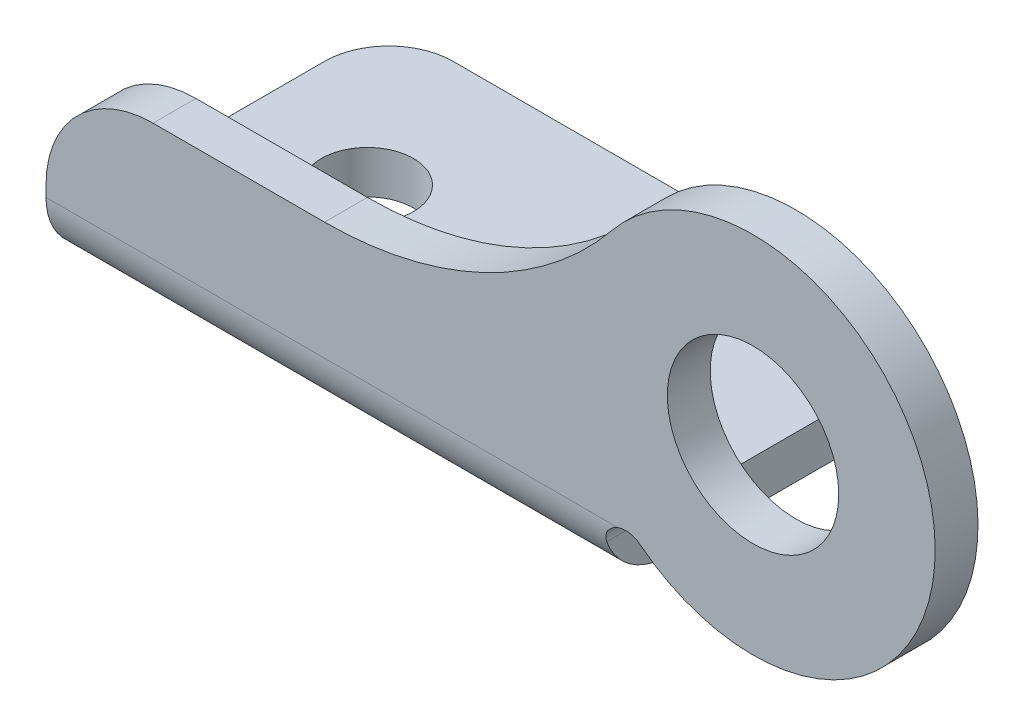
ISO-10303-21;
HEADER;
FILE_DESCRIPTION(('STEP AP214'),'2;1');
FILE_NAME('part.step','',(''),(''),'','','');
FILE_SCHEMA(('AUTOMOTIVE_DESIGN { 1 0 10303 214 1 1 1 1 }'));
ENDSEC;
DATA;
#1=APPLICATION_CONTEXT('core data for automotive mechanical design processes');
#2=APPLICATION_PROTOCOL_DEFINITION('international standard','automotive_design',2000,#1);
#3=PRODUCT_CONTEXT('',#1,'mechanical');
#4=PRODUCT('Part','Part','',(#3));
#5=PRODUCT_RELATED_PRODUCT_CATEGORY('part','',(#4));
#6=PRODUCT_DEFINITION_FORMATION('','',#4);
#7=PRODUCT_DEFINITION_CONTEXT('part definition',#1,'design');
#8=PRODUCT_DEFINITION('design','',#6,#7);
#9=PRODUCT_DEFINITION_SHAPE('','',#8);
#10=(LENGTH_UNIT() NAMED_UNIT(*) SI_UNIT(.MILLI.,.METRE.));
#11=(NAMED_UNIT(*) PLANE_ANGLE_UNIT() SI_UNIT($,.RADIAN.));
#12=(NAMED_UNIT(*) SI_UNIT($,.STERADIAN.) SOLID_ANGLE_UNIT());
#13=UNCERTAINTY_MEASURE_WITH_UNIT(LENGTH_MEASURE(1.E-05),#10,'distance_accuracy_value','');
#14=(GEOMETRIC_REPRESENTATION_CONTEXT(3) GLOBAL_UNCERTAINTY_ASSIGNED_CONTEXT((#13)) GLOBAL_UNIT_ASSIGNED_CONTEXT((#10,
#11,#12)) REPRESENTATION_CONTEXT('',''));
#15=CARTESIAN_POINT('',(0.,0.,0.));
#16=DIRECTION('',(0.,0.,1.));
#17=DIRECTION('',(1.,0.,0.));
#18=AXIS2_PLACEMENT_3D('',#15,#16,#17);
#19=CARTESIAN_POINT('',(0.,2.,0.));
#20=DIRECTION('',(0.,1.,0.));
#21=DIRECTION('',(0.,0.,1.));
#22=AXIS2_PLACEMENT_3D('',#19,#20,#21);
#23=PLANE('',#22);
#24=CARTESIAN_POINT('',(-7.,2.,-0.999999999999999));
#25=DIRECTION('',(0.,1.,0.));
#26=DIRECTION('',(0.,0.,1.));
#27=AXIS2_PLACEMENT_3D('',#24,#25,#26);
#28=CIRCLE('',#27,2.15);
#29=CARTESIAN_POINT('',(-7.,2.,1.15));
#30=VERTEX_POINT('',#29);
#31=EDGE_CURVE('E284',#30,#30,#28,.T.);
#32=ORIENTED_EDGE('',*,*,#31,.F.);
#33=EDGE_LOOP('',(#32));
#34=FACE_BOUND('',#33,.T.);
#35=CARTESIAN_POINT('',(6.,2.,-1.));
#36=DIRECTION('',(0.,1.,0.));
#37=DIRECTION('',(0.,0.,1.));
#38=AXIS2_PLACEMENT_3D('',#35,#36,#37);
#39=CIRCLE('',#38,2.15);
#40=CARTESIAN_POINT('',(6.,2.,1.15));
#41=VERTEX_POINT('',#40);
#42=EDGE_CURVE('E288',#41,#41,#39,.T.);
#43=ORIENTED_EDGE('',*,*,#42,.F.);
#44=EDGE_LOOP('',(#43));
#45=FACE_BOUND('',#44,.T.);
#46=DIRECTION('',(0.,0.,1.));
#47=VECTOR('',#46,1.);
#48=CARTESIAN_POINT('',(-13.,2.,8.));
#49=LINE('',#48,#47);
#50=CARTESIAN_POINT('',(-13.,2.,-5.));
#51=VERTEX_POINT('',#50);
#52=CARTESIAN_POINT('',(-13.,2.,5.));
#53=VERTEX_POINT('',#52);
#54=EDGE_CURVE('E171',#51,#53,#49,.T.);
#55=ORIENTED_EDGE('',*,*,#54,.T.);
#56=DIRECTION('',(1.,0.,0.));
#57=VECTOR('',#56,1.);
#58=CARTESIAN_POINT('',(0.,2.,5.));
#59=LINE('',#58,#57);
#60=CARTESIAN_POINT('',(13.,2.,5.));
#61=VERTEX_POINT('',#60);
#62=EDGE_CURVE('E292',#53,#61,#59,.T.);
#63=ORIENTED_EDGE('',*,*,#62,.T.);
#64=DIRECTION('',(0.,0.,-1.));
#65=VECTOR('',#64,1.);
#66=CARTESIAN_POINT('',(13.,2.,8.));
#67=LINE('',#66,#65);
#68=CARTESIAN_POINT('',(13.,2.,-5.));
#69=VERTEX_POINT('',#68);
#70=EDGE_CURVE('E174',#61,#69,#67,.T.);
#71=ORIENTED_EDGE('',*,*,#70,.T.);
#72=CARTESIAN_POINT('',(10.,2.,-5.));
#73=DIRECTION('',(0.,1.,0.));
#74=DIRECTION('',(0.,0.,1.));
#75=AXIS2_PLACEMENT_3D('',#72,#73,#74);
#76=CIRCLE('',#75,3.);
#77=CARTESIAN_POINT('',(10.,2.,-8.));
#78=VERTEX_POINT('',#77);
#79=EDGE_CURVE('E214',#69,#78,#76,.T.);
#80=ORIENTED_EDGE('',*,*,#79,.T.);
#81=DIRECTION('',(-1.,0.,0.));
#82=VECTOR('',#81,1.);
#83=CARTESIAN_POINT('',(13.,2.,-8.));
#84=LINE('',#83,#82);
#85=CARTESIAN_POINT('',(-9.99999999999999,2.,-8.));
#86=VERTEX_POINT('',#85);
#87=EDGE_CURVE('E178',#78,#86,#84,.T.);
#88=ORIENTED_EDGE('',*,*,#87,.T.);
#89=CARTESIAN_POINT('',(-10.,2.,-5.));
#90=DIRECTION('',(0.,1.,0.));
#91=DIRECTION('',(0.,0.,1.));
#92=AXIS2_PLACEMENT_3D('',#89,#90,#91);
#93=CIRCLE('',#92,3.);
#94=EDGE_CURVE('E212',#86,#51,#93,.T.);
#95=ORIENTED_EDGE('',*,*,#94,.T.);
#96=EDGE_LOOP('',(#55,#63,#71,#80,#88,#95));
#97=FACE_BOUND('',#96,.T.);
#98=ADVANCED_FACE('F33',(#34,#45,#97),#23,.T.);
#99=CARTESIAN_POINT('',(-13.,2.,8.));
#100=DIRECTION('',(1.,0.,0.));
#101=DIRECTION('',(0.,0.,-1.));
#102=AXIS2_PLACEMENT_3D('',#99,#100,#101);
#103=PLANE('',#102);
#104=DIRECTION('',(0.,0.,1.));
#105=VECTOR('',#104,1.);
#106=CARTESIAN_POINT('',(-13.,0.,8.));
#107=LINE('',#106,#105);
#108=CARTESIAN_POINT('',(-13.,0.,-5.));
#109=VERTEX_POINT('',#108);
#110=CARTESIAN_POINT('',(-13.,0.,5.));
#111=VERTEX_POINT('',#110);
#112=EDGE_CURVE('E169',#109,#111,#107,.T.);
#113=ORIENTED_EDGE('',*,*,#112,.T.);
#114=CARTESIAN_POINT('',(-13.,3.,5.));
#115=DIRECTION('',(1.,0.,0.));
#116=DIRECTION('',(0.,0.,-1.));
#117=AXIS2_PLACEMENT_3D('',#114,#115,#116);
#118=CIRCLE('',#117,3.);
#119=CARTESIAN_POINT('',(-13.,3.,8.));
#120=VERTEX_POINT('',#119);
#121=EDGE_CURVE('E299',#111,#120,#118,.F.);
#122=ORIENTED_EDGE('',*,*,#121,.T.);
#123=DIRECTION('',(0.,-1.,0.));
#124=VECTOR('',#123,1.);
#125=CARTESIAN_POINT('',(-13.,2.,8.));
#126=LINE('',#125,#124);
#127=CARTESIAN_POINT('',(-13.,3.5,8.));
#128=VERTEX_POINT('',#127);
#129=EDGE_CURVE('E181',#128,#120,#126,.T.);
#130=ORIENTED_EDGE('',*,*,#129,.F.);
#131=DIRECTION('',(0.,0.,1.));
#132=VECTOR('',#131,1.);
#133=CARTESIAN_POINT('',(-13.,3.5,6.));
#134=LINE('',#133,#132);
#135=CARTESIAN_POINT('',(-13.,3.5,6.));
#136=VERTEX_POINT('',#135);
#137=EDGE_CURVE('E195',#128,#136,#134,.F.);
#138=ORIENTED_EDGE('',*,*,#137,.T.);
#139=DIRECTION('',(0.,-1.,0.));
#140=VECTOR('',#139,1.);
#141=CARTESIAN_POINT('',(-13.,2.,6.));
#142=LINE('',#141,#140);
#143=CARTESIAN_POINT('',(-13.,3.,6.));
#144=VERTEX_POINT('',#143);
#145=EDGE_CURVE('E142',#136,#144,#142,.T.);
#146=ORIENTED_EDGE('',*,*,#145,.T.);
#147=CARTESIAN_POINT('',(-13.,3.,5.));
#148=DIRECTION('',(1.,0.,0.));
#149=DIRECTION('',(0.,0.,-1.));
#150=AXIS2_PLACEMENT_3D('',#147,#148,#149);
#151=CIRCLE('',#150,1.);
#152=EDGE_CURVE('E11',#144,#53,#151,.T.);
#153=ORIENTED_EDGE('',*,*,#152,.T.);
#154=ORIENTED_EDGE('',*,*,#54,.F.);
#155=DIRECTION('',(0.,-1.,0.));
#156=VECTOR('',#155,1.);
#157=CARTESIAN_POINT('',(-13.,2.,-5.));
#158=LINE('',#157,#156);
#159=EDGE_CURVE('E216',#51,#109,#158,.T.);
#160=ORIENTED_EDGE('',*,*,#159,.T.);
#161=EDGE_LOOP('',(#113,#122,#130,#138,#146,#153,#154,#160));
#162=FACE_BOUND('',#161,.T.);
#163=ADVANCED_FACE('F256',(#162),#103,.F.);
#164=CARTESIAN_POINT('',(13.,2.,8.));
#165=DIRECTION('',(0.,0.,-1.));
#166=DIRECTION('',(-1.,0.,0.));
#167=AXIS2_PLACEMENT_3D('',#164,#165,#166);
#168=PLANE('',#167);
#169=CARTESIAN_POINT('',(20.,9.5,8.));
#170=DIRECTION('',(0.,0.,1.));
#171=DIRECTION('',(1.,0.,0.));
#172=AXIS2_PLACEMENT_3D('',#169,#170,#171);
#173=CIRCLE('',#172,4.);
#174=CARTESIAN_POINT('',(24.,9.5,8.));
#175=VERTEX_POINT('',#174);
#176=EDGE_CURVE('E222',#175,#175,#173,.T.);
#177=ORIENTED_EDGE('',*,*,#176,.F.);
#178=EDGE_LOOP('',(#177));
#179=FACE_BOUND('',#178,.T.);
#180=ORIENTED_EDGE('',*,*,#129,.T.);
#181=DIRECTION('',(1.,0.,0.));
#182=VECTOR('',#181,1.);
#183=CARTESIAN_POINT('',(13.,3.,8.));
#184=LINE('',#183,#182);
#185=CARTESIAN_POINT('',(13.6995577903553,3.,8.));
#186=VERTEX_POINT('',#185);
#187=EDGE_CURVE('E219',#120,#186,#184,.T.);
#188=ORIENTED_EDGE('',*,*,#187,.T.);
#189=CARTESIAN_POINT('',(14.0645161290323,2.,8.));
#190=DIRECTION('',(0.,0.,-1.));
#191=DIRECTION('',(1.,0.,0.));
#192=AXIS2_PLACEMENT_3D('',#189,#190,#191);
#193=CIRCLE('',#192,1.06451612903226);
#194=CARTESIAN_POINT('',(14.7251264755481,2.83473861720068,8.));
#195=VERTEX_POINT('',#194);
#196=EDGE_CURVE('E158',#186,#195,#193,.T.);
#197=ORIENTED_EDGE('',*,*,#196,.T.);
#198=CARTESIAN_POINT('',(20.,9.5,8.));
#199=DIRECTION('',(0.,0.,1.));
#200=DIRECTION('',(-1.,0.,0.));
#201=AXIS2_PLACEMENT_3D('',#198,#199,#200);
#202=CIRCLE('',#201,8.5);
#203=CARTESIAN_POINT('',(13.4115247322795,14.8704742478327,8.));
#204=VERTEX_POINT('',#203);
#205=EDGE_CURVE('E140',#195,#204,#202,.T.);
#206=ORIENTED_EDGE('',*,*,#205,.T.);
#207=CARTESIAN_POINT('',(0.,25.8026315789474,8.));
#208=DIRECTION('',(0.,0.,-1.));
#209=DIRECTION('',(1.,0.,0.));
#210=AXIS2_PLACEMENT_3D('',#207,#208,#209);
#211=CIRCLE('',#210,17.3026315789474);
#212=CARTESIAN_POINT('',(0.,8.5,8.));
#213=VERTEX_POINT('',#212);
#214=EDGE_CURVE('E162',#204,#213,#211,.T.);
#215=ORIENTED_EDGE('',*,*,#214,.T.);
#216=DIRECTION('',(-1.,0.,0.));
#217=VECTOR('',#216,1.);
#218=CARTESIAN_POINT('',(-13.,8.5,8.));
#219=LINE('',#218,#217);
#220=CARTESIAN_POINT('',(-8.,8.5,8.));
#221=VERTEX_POINT('',#220);
#222=EDGE_CURVE('E134',#213,#221,#219,.T.);
#223=ORIENTED_EDGE('',*,*,#222,.T.);
#224=CARTESIAN_POINT('',(-8.,3.5,8.));
#225=DIRECTION('',(0.,0.,-1.));
#226=DIRECTION('',(-1.,0.,0.));
#227=AXIS2_PLACEMENT_3D('',#224,#225,#226);
#228=CIRCLE('',#227,5.);
#229=EDGE_CURVE('E193',#221,#128,#228,.F.);
#230=ORIENTED_EDGE('',*,*,#229,.T.);
#231=EDGE_LOOP('',(#180,#188,#197,#206,#215,#223,#230));
#232=FACE_BOUND('',#231,.T.);
#233=ADVANCED_FACE('F259',(#179,#232),#168,.F.);
#234=CARTESIAN_POINT('',(13.,2.,8.));
#235=DIRECTION('',(-1.,0.,0.));
#236=DIRECTION('',(0.,0.,1.));
#237=AXIS2_PLACEMENT_3D('',#234,#235,#236);
#238=PLANE('',#237);
#239=CARTESIAN_POINT('',(13.,2.,7.82842712474619));
#240=VERTEX_POINT('',#239);
#241=EDGE_CURVE('E176',#240,#61,#67,.T.);
#242=ORIENTED_EDGE('',*,*,#241,.F.);
#243=CARTESIAN_POINT('',(13.,3.,5.));
#244=DIRECTION('',(-1.,0.,0.));
#245=DIRECTION('',(0.,0.,1.));
#246=AXIS2_PLACEMENT_3D('',#243,#244,#245);
#247=CIRCLE('',#246,3.);
#248=CARTESIAN_POINT('',(13.,0.,5.));
#249=VERTEX_POINT('',#248);
#250=EDGE_CURVE('E232',#240,#249,#247,.F.);
#251=ORIENTED_EDGE('',*,*,#250,.T.);
#252=DIRECTION('',(0.,0.,-1.));
#253=VECTOR('',#252,1.);
#254=CARTESIAN_POINT('',(13.,0.,8.));
#255=LINE('',#254,#253);
#256=CARTESIAN_POINT('',(13.,0.,-5.));
#257=VERTEX_POINT('',#256);
#258=EDGE_CURVE('E184',#249,#257,#255,.T.);
#259=ORIENTED_EDGE('',*,*,#258,.T.);
#260=DIRECTION('',(0.,-1.,0.));
#261=VECTOR('',#260,1.);
#262=CARTESIAN_POINT('',(13.,2.,-5.));
#263=LINE('',#262,#261);
#264=EDGE_CURVE('E209',#257,#69,#263,.F.);
#265=ORIENTED_EDGE('',*,*,#264,.T.);
#266=ORIENTED_EDGE('',*,*,#70,.F.);
#267=EDGE_LOOP('',(#242,#251,#259,#265,#266));
#268=FACE_BOUND('',#267,.T.);
#269=ADVANCED_FACE('F263',(#268),#238,.F.);
#270=CARTESIAN_POINT('',(13.,2.,-8.));
#271=DIRECTION('',(0.,0.,1.));
#272=DIRECTION('',(1.,0.,0.));
#273=AXIS2_PLACEMENT_3D('',#270,#271,#272);
#274=PLANE('',#273);
#275=ORIENTED_EDGE('',*,*,#87,.F.);
#276=DIRECTION('',(0.,-1.,0.));
#277=VECTOR('',#276,1.);
#278=CARTESIAN_POINT('',(10.,2.,-8.));
#279=LINE('',#278,#277);
#280=CARTESIAN_POINT('',(10.,0.,-8.));
#281=VERTEX_POINT('',#280);
#282=EDGE_CURVE('E201',#78,#281,#279,.T.);
#283=ORIENTED_EDGE('',*,*,#282,.T.);
#284=DIRECTION('',(-1.,0.,0.));
#285=VECTOR('',#284,1.);
#286=CARTESIAN_POINT('',(13.,0.,-8.));
#287=LINE('',#286,#285);
#288=CARTESIAN_POINT('',(-9.99999999999999,0.,-8.));
#289=VERTEX_POINT('',#288);
#290=EDGE_CURVE('E175',#281,#289,#287,.T.);
#291=ORIENTED_EDGE('',*,*,#290,.T.);
#292=DIRECTION('',(0.,-1.,0.));
#293=VECTOR('',#292,1.);
#294=CARTESIAN_POINT('',(-10.,2.,-8.));
#295=LINE('',#294,#293);
#296=EDGE_CURVE('E199',#289,#86,#295,.F.);
#297=ORIENTED_EDGE('',*,*,#296,.T.);
#298=EDGE_LOOP('',(#275,#283,#291,#297));
#299=FACE_BOUND('',#298,.T.);
#300=ADVANCED_FACE('F267',(#299),#274,.F.);
#301=CARTESIAN_POINT('',(0.,0.,0.));
#302=DIRECTION('',(0.,1.,0.));
#303=DIRECTION('',(0.,0.,1.));
#304=AXIS2_PLACEMENT_3D('',#301,#302,#303);
#305=PLANE('',#304);
#306=CARTESIAN_POINT('',(-7.,0.,-0.999999999999999));
#307=DIRECTION('',(0.,1.,0.));
#308=DIRECTION('',(0.,0.,1.));
#309=AXIS2_PLACEMENT_3D('',#306,#307,#308);
#310=CIRCLE('',#309,2.15);
#311=CARTESIAN_POINT('',(-7.,0.,1.15));
#312=VERTEX_POINT('',#311);
#313=EDGE_CURVE('E354',#312,#312,#310,.T.);
#314=ORIENTED_EDGE('',*,*,#313,.T.);
#315=EDGE_LOOP('',(#314));
#316=FACE_BOUND('',#315,.T.);
#317=CARTESIAN_POINT('',(6.,0.,-1.));
#318=DIRECTION('',(0.,1.,0.));
#319=DIRECTION('',(0.,0.,1.));
#320=AXIS2_PLACEMENT_3D('',#317,#318,#319);
#321=CIRCLE('',#320,2.15);
#322=CARTESIAN_POINT('',(6.,0.,1.15));
#323=VERTEX_POINT('',#322);
#324=EDGE_CURVE('E355',#323,#323,#321,.T.);
#325=ORIENTED_EDGE('',*,*,#324,.T.);
#326=EDGE_LOOP('',(#325));
#327=FACE_BOUND('',#326,.T.);
#328=ORIENTED_EDGE('',*,*,#258,.F.);
#329=DIRECTION('',(1.,0.,0.));
#330=VECTOR('',#329,1.);
#331=CARTESIAN_POINT('',(0.,0.,5.));
#332=LINE('',#331,#330);
#333=EDGE_CURVE('E302',#249,#111,#332,.F.);
#334=ORIENTED_EDGE('',*,*,#333,.T.);
#335=ORIENTED_EDGE('',*,*,#112,.F.);
#336=CARTESIAN_POINT('',(-10.,0.,-5.));
#337=DIRECTION('',(0.,1.,0.));
#338=DIRECTION('',(0.,0.,1.));
#339=AXIS2_PLACEMENT_3D('',#336,#337,#338);
#340=CIRCLE('',#339,3.);
#341=EDGE_CURVE('E204',#109,#289,#340,.F.);
#342=ORIENTED_EDGE('',*,*,#341,.T.);
#343=ORIENTED_EDGE('',*,*,#290,.F.);
#344=CARTESIAN_POINT('',(10.,0.,-5.));
#345=DIRECTION('',(0.,1.,0.));
#346=DIRECTION('',(0.,0.,1.));
#347=AXIS2_PLACEMENT_3D('',#344,#345,#346);
#348=CIRCLE('',#347,3.);
#349=EDGE_CURVE('E206',#281,#257,#348,.F.);
#350=ORIENTED_EDGE('',*,*,#349,.T.);
#351=EDGE_LOOP('',(#328,#334,#335,#342,#343,#350));
#352=FACE_BOUND('',#351,.T.);
#353=ADVANCED_FACE('F271',(#316,#327,#352),#305,.F.);
#354=CARTESIAN_POINT('',(-13.,8.5,6.));
#355=DIRECTION('',(0.,1.,0.));
#356=DIRECTION('',(0.,0.,1.));
#357=AXIS2_PLACEMENT_3D('',#354,#355,#356);
#358=PLANE('',#357);
#359=DIRECTION('',(-1.,0.,0.));
#360=VECTOR('',#359,1.);
#361=CARTESIAN_POINT('',(-13.,8.5,6.));
#362=LINE('',#361,#360);
#363=CARTESIAN_POINT('',(0.,8.5,6.));
#364=VERTEX_POINT('',#363);
#365=CARTESIAN_POINT('',(-8.,8.5,6.));
#366=VERTEX_POINT('',#365);
#367=EDGE_CURVE('E150',#364,#366,#362,.T.);
#368=ORIENTED_EDGE('',*,*,#367,.T.);
#369=DIRECTION('',(0.,0.,1.));
#370=VECTOR('',#369,1.);
#371=CARTESIAN_POINT('',(-8.,8.5,8.));
#372=LINE('',#371,#370);
#373=EDGE_CURVE('E190',#366,#221,#372,.T.);
#374=ORIENTED_EDGE('',*,*,#373,.T.);
#375=ORIENTED_EDGE('',*,*,#222,.F.);
#376=DIRECTION('',(0.,0.,1.));
#377=VECTOR('',#376,1.);
#378=CARTESIAN_POINT('',(0.,8.5,6.));
#379=LINE('',#378,#377);
#380=EDGE_CURVE('E167',#364,#213,#379,.T.);
#381=ORIENTED_EDGE('',*,*,#380,.F.);
#382=EDGE_LOOP('',(#368,#374,#375,#381));
#383=FACE_BOUND('',#382,.T.);
#384=ADVANCED_FACE('F274',(#383),#358,.T.);
#385=CARTESIAN_POINT('',(0.,25.8026315789474,6.));
#386=DIRECTION('',(0.,0.,1.));
#387=DIRECTION('',(1.,0.,0.));
#388=AXIS2_PLACEMENT_3D('',#385,#386,#387);
#389=CYLINDRICAL_SURFACE('',#388,17.3026315789474);
#390=ORIENTED_EDGE('',*,*,#214,.F.);
#391=DIRECTION('',(0.,0.,1.));
#392=VECTOR('',#391,1.);
#393=CARTESIAN_POINT('',(13.4115247322795,14.8704742478327,6.));
#394=LINE('',#393,#392);
#395=CARTESIAN_POINT('',(13.4115247322795,14.8704742478327,6.));
#396=VERTEX_POINT('',#395);
#397=EDGE_CURVE('E141',#396,#204,#394,.T.);
#398=ORIENTED_EDGE('',*,*,#397,.F.);
#399=CARTESIAN_POINT('',(0.,25.8026315789474,6.));
#400=DIRECTION('',(0.,0.,-1.));
#401=DIRECTION('',(1.,0.,0.));
#402=AXIS2_PLACEMENT_3D('',#399,#400,#401);
#403=CIRCLE('',#402,17.3026315789474);
#404=EDGE_CURVE('E148',#396,#364,#403,.T.);
#405=ORIENTED_EDGE('',*,*,#404,.T.);
#406=ORIENTED_EDGE('',*,*,#380,.T.);
#407=EDGE_LOOP('',(#390,#398,#405,#406));
#408=FACE_BOUND('',#407,.T.);
#409=ADVANCED_FACE('F328',(#408),#389,.F.);
#410=CARTESIAN_POINT('',(20.,9.5,6.));
#411=DIRECTION('',(0.,0.,1.));
#412=DIRECTION('',(1.,0.,0.));
#413=AXIS2_PLACEMENT_3D('',#410,#411,#412);
#414=CYLINDRICAL_SURFACE('',#413,8.5);
#415=ORIENTED_EDGE('',*,*,#205,.F.);
#416=DIRECTION('',(0.,0.,1.));
#417=VECTOR('',#416,1.);
#418=CARTESIAN_POINT('',(14.7251264755481,2.83473861720068,6.));
#419=LINE('',#418,#417);
#420=CARTESIAN_POINT('',(14.7251264755481,2.83473861720068,6.));
#421=VERTEX_POINT('',#420);
#422=EDGE_CURVE('E128',#421,#195,#419,.T.);
#423=ORIENTED_EDGE('',*,*,#422,.F.);
#424=CARTESIAN_POINT('',(20.,9.5,6.));
#425=DIRECTION('',(0.,0.,1.));
#426=DIRECTION('',(-1.,0.,0.));
#427=AXIS2_PLACEMENT_3D('',#424,#425,#426);
#428=CIRCLE('',#427,8.5);
#429=EDGE_CURVE('E133',#421,#396,#428,.T.);
#430=ORIENTED_EDGE('',*,*,#429,.T.);
#431=ORIENTED_EDGE('',*,*,#397,.T.);
#432=EDGE_LOOP('',(#415,#423,#430,#431));
#433=FACE_BOUND('',#432,.T.);
#434=ADVANCED_FACE('F138',(#433),#414,.T.);
#435=CARTESIAN_POINT('',(14.0645161290323,2.,6.));
#436=DIRECTION('',(0.,0.,1.));
#437=DIRECTION('',(1.,0.,0.));
#438=AXIS2_PLACEMENT_3D('',#435,#436,#437);
#439=CYLINDRICAL_SURFACE('',#438,1.06451612903226);
#440=ORIENTED_EDGE('',*,*,#196,.F.);
#441=CARTESIAN_POINT('',(13.6995577903553,3.,8.));
#442=CARTESIAN_POINT('',(13.6717473979177,2.98985010028974,7.99999810862434));
#443=CARTESIAN_POINT('',(13.6443735025637,2.97854450947711,7.99994855769336));
#444=CARTESIAN_POINT('',(13.590661654823,2.95369448710633,7.99966880079897));
#445=CARTESIAN_POINT('',(13.5643237324385,2.94014999076735,7.9994385896076));
#446=CARTESIAN_POINT('',(13.4871268766409,2.89627711422229,7.99834918258875));
#447=CARTESIAN_POINT('',(13.4380672191469,2.86270289317648,7.99709131905181));
#448=CARTESIAN_POINT('',(13.346230952651,2.78789354590784,7.99272646986532));
#449=CARTESIAN_POINT('',(13.303460524938,2.74665097188456,7.98961768000486));
#450=CARTESIAN_POINT('',(13.2255031392332,2.65782717351866,7.9807553178437));
#451=CARTESIAN_POINT('',(13.1903088862738,2.61025211871104,7.9750043065719));
#452=CARTESIAN_POINT('',(13.1289718185312,2.51116599953028,7.96032169094153));
#453=CARTESIAN_POINT('',(13.1026859351797,2.45973514820545,7.95144554602232));
#454=CARTESIAN_POINT('',(13.058923218586,2.35391384656502,7.93009942971657));
#455=CARTESIAN_POINT('',(13.041450370056,2.29952206979287,7.91762783668746));
#456=CARTESIAN_POINT('',(13.0188865401041,2.20395788783891,7.89276336750771));
#457=CARTESIAN_POINT('',(13.0117555029117,2.16303422012126,7.88119688165311));
#458=CARTESIAN_POINT('',(13.00231126439,2.08130020642531,7.85619262055199));
#459=CARTESIAN_POINT('',(12.9999874238244,2.04048981025867,7.84275904805039));
#460=CARTESIAN_POINT('',(13.,2.,7.82842712474619));
#461=B_SPLINE_CURVE_WITH_KNOTS('',3,(#441,#442,#443,#444,#445,#446,#447,#448,#449,#450,#451,
#452,#453,#454,#455,#456,#457,#458,#459,#460),.UNSPECIFIED.,.F.,.F.,(4,2,2,2,2,2,2,2,2,4),(0.,
0.0887606071773808,0.177523783016655,0.354994503193237,0.532638498791609,0.710110671278475,
0.884580152999629,1.05912844853037,1.18819139910636,1.31696840199751),.UNSPECIFIED.);
#462=EDGE_CURVE('E225',#186,#240,#461,.T.);
#463=ORIENTED_EDGE('',*,*,#462,.T.);
#464=ORIENTED_EDGE('',*,*,#241,.T.);
#465=CARTESIAN_POINT('',(13.,2.,5.));
#466=CARTESIAN_POINT('',(13.0000079993583,1.99999742901865,5.02787218698077));
#467=CARTESIAN_POINT('',(13.00000020403,2.00116529000581,5.05574307441058));
#468=CARTESIAN_POINT('',(13.0000112612269,2.00582192854867,5.11129001519317));
#469=CARTESIAN_POINT('',(13.000030113462,2.0093106808378,5.13896607066369));
#470=CARTESIAN_POINT('',(13.0001527895474,2.01859588393985,5.19397158745139));
#471=CARTESIAN_POINT('',(13.0002567365967,2.02439567438176,5.22130048786929));
#472=CARTESIAN_POINT('',(13.0006652909066,2.038255763618,5.27536896889814));
#473=CARTESIAN_POINT('',(13.0009698956007,2.04631603349756,5.30210855704254));
#474=CARTESIAN_POINT('',(13.0024016480382,2.07383218371498,5.38121434222743));
#475=CARTESIAN_POINT('',(13.0040467856268,2.09662226336845,5.43246083369973));
#476=CARTESIAN_POINT('',(13.0103237320473,2.15032730315677,5.53025105400655));
#477=CARTESIAN_POINT('',(13.014953055601,2.18123548972076,5.57679865887446));
#478=CARTESIAN_POINT('',(13.0289192154157,2.24875046750912,5.66217669113017));
#479=CARTESIAN_POINT('',(13.0380864722712,2.2851212795143,5.70121944025134));
#480=CARTESIAN_POINT('',(13.0627693188753,2.36239598142059,5.77214082165219));
#481=CARTESIAN_POINT('',(13.0782768767231,2.40329408851099,5.80402843919183));
#482=CARTESIAN_POINT('',(13.1144101563407,2.48179209229737,5.856394256252));
#483=CARTESIAN_POINT('',(13.1341712086533,2.51917852654642,5.87779359439872));
#484=CARTESIAN_POINT('',(13.1796081125461,2.59331198283864,5.91450295021385));
#485=CARTESIAN_POINT('',(13.2052815847002,2.63005925572787,5.92981541077794));
#486=CARTESIAN_POINT('',(13.2606845229158,2.69922415038156,5.95436674924948));
#487=CARTESIAN_POINT('',(13.290141576495,2.7317668971269,5.96387472648097));
#488=CARTESIAN_POINT('',(13.3534193358282,2.79340629128761,5.9789426882467));
#489=CARTESIAN_POINT('',(13.3872477436646,2.82249667802191,5.98449558894212));
#490=CARTESIAN_POINT('',(13.4648689943754,2.88112502630073,5.99342864142253));
#491=CARTESIAN_POINT('',(13.5093642142476,2.90982347645952,5.99624716161202));
#492=CARTESIAN_POINT('',(13.5788526338484,2.94764070441847,5.99870773093767));
#493=CARTESIAN_POINT('',(13.6024474392264,2.95936535285929,5.99923374857442));
#494=CARTESIAN_POINT('',(13.6504327430442,2.98103045668625,5.99987789022435));
#495=CARTESIAN_POINT('',(13.6748227970816,2.99097188904283,5.99999623823846));
#496=CARTESIAN_POINT('',(13.6995577903553,3.,6.));
#497=B_SPLINE_CURVE_WITH_KNOTS('',3,(#465,#466,#467,#468,#469,#470,#471,#472,#473,#474,#475,
#476,#477,#478,#479,#480,#481,#482,#483,#484,#485,#486,#487,#488,#489,#490,#491,#492,#493,#494,
#495,#496),.UNSPECIFIED.,.F.,.F.,(4,2,2,2,2,2,2,2,2,2,2,2,2,2,2,4),(0.,0.0835897358201915,
0.167178561649055,0.250888620425398,0.33459760847893,0.502035795396121,0.669334716931499,
0.830806591365184,0.992074543729156,1.13349712512979,1.2748628908214,1.40904485754805,
1.54346655398425,1.70178109858471,1.78077651075004,1.85972851062766),.UNSPECIFIED.);
#498=CARTESIAN_POINT('',(13.6995577903553,3.,6.));
#499=VERTEX_POINT('',#498);
#500=EDGE_CURVE('E43',#61,#499,#497,.T.);
#501=ORIENTED_EDGE('',*,*,#500,.T.);
#502=CARTESIAN_POINT('',(14.0645161290323,2.,6.));
#503=DIRECTION('',(0.,0.,-1.));
#504=DIRECTION('',(1.,0.,0.));
#505=AXIS2_PLACEMENT_3D('',#502,#503,#504);
#506=CIRCLE('',#505,1.06451612903226);
#507=EDGE_CURVE('E124',#499,#421,#506,.T.);
#508=ORIENTED_EDGE('',*,*,#507,.T.);
#509=ORIENTED_EDGE('',*,*,#422,.T.);
#510=EDGE_LOOP('',(#440,#463,#464,#501,#508,#509));
#511=FACE_BOUND('',#510,.T.);
#512=ADVANCED_FACE('F127',(#511),#439,.F.);
#513=CARTESIAN_POINT('',(0.,25.8026315789474,6.));
#514=DIRECTION('',(0.,0.,1.));
#515=DIRECTION('',(1.,0.,0.));
#516=AXIS2_PLACEMENT_3D('',#513,#514,#515);
#517=PLANE('',#516);
#518=CARTESIAN_POINT('',(20.,9.5,6.));
#519=DIRECTION('',(0.,0.,1.));
#520=DIRECTION('',(1.,0.,0.));
#521=AXIS2_PLACEMENT_3D('',#518,#519,#520);
#522=CIRCLE('',#521,4.);
#523=CARTESIAN_POINT('',(24.,9.5,6.));
#524=VERTEX_POINT('',#523);
#525=EDGE_CURVE('E160',#524,#524,#522,.T.);
#526=ORIENTED_EDGE('',*,*,#525,.T.);
#527=EDGE_LOOP('',(#526));
#528=FACE_BOUND('',#527,.T.);
#529=ORIENTED_EDGE('',*,*,#507,.F.);
#530=DIRECTION('',(1.,0.,0.));
#531=VECTOR('',#530,1.);
#532=CARTESIAN_POINT('',(0.,3.,6.));
#533=LINE('',#532,#531);
#534=EDGE_CURVE('E298',#499,#144,#533,.F.);
#535=ORIENTED_EDGE('',*,*,#534,.T.);
#536=ORIENTED_EDGE('',*,*,#145,.F.);
#537=CARTESIAN_POINT('',(-8.,3.5,6.));
#538=DIRECTION('',(0.,0.,1.));
#539=DIRECTION('',(1.,0.,0.));
#540=AXIS2_PLACEMENT_3D('',#537,#538,#539);
#541=CIRCLE('',#540,5.);
#542=EDGE_CURVE('E197',#136,#366,#541,.F.);
#543=ORIENTED_EDGE('',*,*,#542,.T.);
#544=ORIENTED_EDGE('',*,*,#367,.F.);
#545=ORIENTED_EDGE('',*,*,#404,.F.);
#546=ORIENTED_EDGE('',*,*,#429,.F.);
#547=EDGE_LOOP('',(#529,#535,#536,#543,#544,#545,#546));
#548=FACE_BOUND('',#547,.T.);
#549=ADVANCED_FACE('F145',(#528,#548),#517,.F.);
#550=CARTESIAN_POINT('',(-8.,3.5,6.));
#551=DIRECTION('',(0.,0.,-1.));
#552=DIRECTION('',(-1.,0.,0.));
#553=AXIS2_PLACEMENT_3D('',#550,#551,#552);
#554=CYLINDRICAL_SURFACE('',#553,5.);
#555=ORIENTED_EDGE('',*,*,#542,.F.);
#556=ORIENTED_EDGE('',*,*,#137,.F.);
#557=ORIENTED_EDGE('',*,*,#229,.F.);
#558=ORIENTED_EDGE('',*,*,#373,.F.);
#559=EDGE_LOOP('',(#555,#556,#557,#558));
#560=FACE_BOUND('',#559,.T.);
#561=ADVANCED_FACE('F251',(#560),#554,.T.);
#562=CARTESIAN_POINT('',(10.,2.,-5.));
#563=DIRECTION('',(0.,-1.,0.));
#564=DIRECTION('',(0.,0.,-1.));
#565=AXIS2_PLACEMENT_3D('',#562,#563,#564);
#566=CYLINDRICAL_SURFACE('',#565,3.);
#567=ORIENTED_EDGE('',*,*,#79,.F.);
#568=ORIENTED_EDGE('',*,*,#264,.F.);
#569=ORIENTED_EDGE('',*,*,#349,.F.);
#570=ORIENTED_EDGE('',*,*,#282,.F.);
#571=EDGE_LOOP('',(#567,#568,#569,#570));
#572=FACE_BOUND('',#571,.T.);
#573=ADVANCED_FACE('F247',(#572),#566,.T.);
#574=CARTESIAN_POINT('',(-10.,2.,-5.));
#575=DIRECTION('',(0.,-1.,0.));
#576=DIRECTION('',(0.,0.,-1.));
#577=AXIS2_PLACEMENT_3D('',#574,#575,#576);
#578=CYLINDRICAL_SURFACE('',#577,3.);
#579=ORIENTED_EDGE('',*,*,#94,.F.);
#580=ORIENTED_EDGE('',*,*,#296,.F.);
#581=ORIENTED_EDGE('',*,*,#341,.F.);
#582=ORIENTED_EDGE('',*,*,#159,.F.);
#583=EDGE_LOOP('',(#579,#580,#581,#582));
#584=FACE_BOUND('',#583,.T.);
#585=ADVANCED_FACE('F243',(#584),#578,.T.);
#586=CARTESIAN_POINT('',(20.,9.5,-8.));
#587=DIRECTION('',(0.,0.,1.));
#588=DIRECTION('',(1.,0.,0.));
#589=AXIS2_PLACEMENT_3D('',#586,#587,#588);
#590=CYLINDRICAL_SURFACE('',#589,4.);
#591=ORIENTED_EDGE('',*,*,#176,.T.);
#592=EDGE_LOOP('',(#591));
#593=FACE_BOUND('',#592,.T.);
#594=ORIENTED_EDGE('',*,*,#525,.F.);
#595=EDGE_LOOP('',(#594));
#596=FACE_BOUND('',#595,.T.);
#597=ADVANCED_FACE('F246',(#593,#596),#590,.F.);
#598=CARTESIAN_POINT('',(6.,0.,-1.));
#599=DIRECTION('',(0.,1.,0.));
#600=DIRECTION('',(0.,0.,1.));
#601=AXIS2_PLACEMENT_3D('',#598,#599,#600);
#602=CYLINDRICAL_SURFACE('',#601,2.15);
#603=ORIENTED_EDGE('',*,*,#324,.F.);
#604=EDGE_LOOP('',(#603));
#605=FACE_BOUND('',#604,.T.);
#606=ORIENTED_EDGE('',*,*,#42,.T.);
#607=EDGE_LOOP('',(#606));
#608=FACE_BOUND('',#607,.T.);
#609=ADVANCED_FACE('F342',(#605,#608),#602,.F.);
#610=CARTESIAN_POINT('',(-7.,0.,-0.999999999999999));
#611=DIRECTION('',(0.,1.,0.));
#612=DIRECTION('',(0.,0.,1.));
#613=AXIS2_PLACEMENT_3D('',#610,#611,#612);
#614=CYLINDRICAL_SURFACE('',#613,2.15);
#615=ORIENTED_EDGE('',*,*,#313,.F.);
#616=EDGE_LOOP('',(#615));
#617=FACE_BOUND('',#616,.T.);
#618=ORIENTED_EDGE('',*,*,#31,.T.);
#619=EDGE_LOOP('',(#618));
#620=FACE_BOUND('',#619,.T.);
#621=ADVANCED_FACE('F241',(#617,#620),#614,.F.);
#622=CARTESIAN_POINT('',(13.,3.,5.));
#623=DIRECTION('',(1.,0.,0.));
#624=DIRECTION('',(0.,0.,-1.));
#625=AXIS2_PLACEMENT_3D('',#622,#623,#624);
#626=CYLINDRICAL_SURFACE('',#625,3.);
#627=ORIENTED_EDGE('',*,*,#121,.F.);
#628=ORIENTED_EDGE('',*,*,#333,.F.);
#629=ORIENTED_EDGE('',*,*,#250,.F.);
#630=ORIENTED_EDGE('',*,*,#462,.F.);
#631=ORIENTED_EDGE('',*,*,#187,.F.);
#632=EDGE_LOOP('',(#627,#628,#629,#630,#631));
#633=FACE_BOUND('',#632,.T.);
#634=ADVANCED_FACE('F237',(#633),#626,.T.);
#635=CARTESIAN_POINT('',(0.,3.,5.));
#636=DIRECTION('',(1.,0.,0.));
#637=DIRECTION('',(0.,0.,-1.));
#638=AXIS2_PLACEMENT_3D('',#635,#636,#637);
#639=CYLINDRICAL_SURFACE('',#638,1.);
#640=ORIENTED_EDGE('',*,*,#152,.F.);
#641=ORIENTED_EDGE('',*,*,#534,.F.);
#642=ORIENTED_EDGE('',*,*,#500,.F.);
#643=ORIENTED_EDGE('',*,*,#62,.F.);
#644=EDGE_LOOP('',(#640,#641,#642,#643));
#645=FACE_BOUND('',#644,.T.);
#646=ADVANCED_FACE('F35',(#645),#639,.F.);
#647=CLOSED_SHELL('',(#98,#163,#233,#269,#300,#353,#384,#409,#434,#512,#549,#561,#573,#585,#597,
#609,#621,#634,#646));
#648=MANIFOLD_SOLID_BREP('B2',#647);
#649=ADVANCED_BREP_SHAPE_REPRESENTATION('',(#18,#648),#14);
#650=SHAPE_DEFINITION_REPRESENTATION(#9,#649);
ENDSEC;
END-ISO-10303-21;
